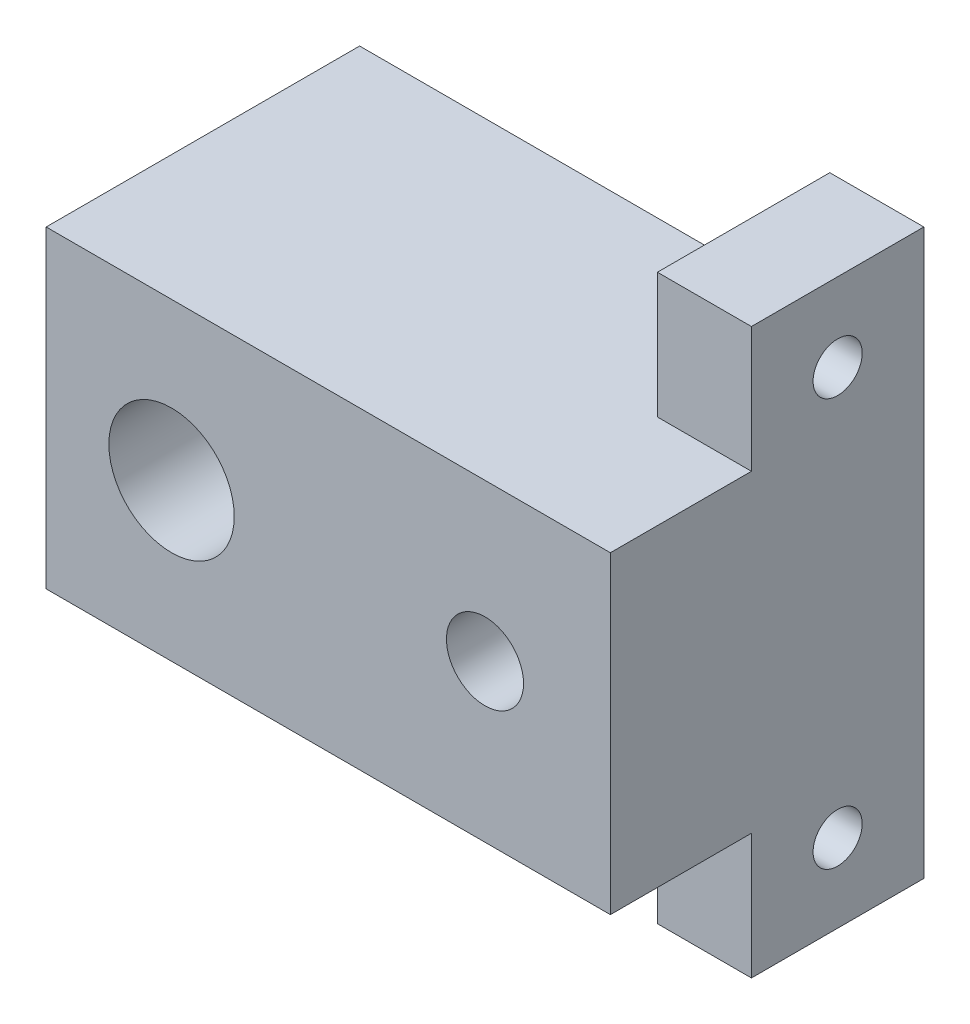
ISO-10303-21;
HEADER;
FILE_DESCRIPTION(('STEP AP214'),'2;1');
FILE_NAME('part.step','',(''),(''),'','','');
FILE_SCHEMA(('AUTOMOTIVE_DESIGN { 1 0 10303 214 1 1 1 1 }'));
ENDSEC;
DATA;
#1=APPLICATION_CONTEXT('core data for automotive mechanical design processes');
#2=APPLICATION_PROTOCOL_DEFINITION('international standard','automotive_design',2000,#1);
#3=PRODUCT_CONTEXT('',#1,'mechanical');
#4=PRODUCT('Part','Part','',(#3));
#5=PRODUCT_RELATED_PRODUCT_CATEGORY('part','',(#4));
#6=PRODUCT_DEFINITION_FORMATION('','',#4);
#7=PRODUCT_DEFINITION_CONTEXT('part definition',#1,'design');
#8=PRODUCT_DEFINITION('design','',#6,#7);
#9=PRODUCT_DEFINITION_SHAPE('','',#8);
#10=(LENGTH_UNIT() NAMED_UNIT(*) SI_UNIT(.MILLI.,.METRE.));
#11=(NAMED_UNIT(*) PLANE_ANGLE_UNIT() SI_UNIT($,.RADIAN.));
#12=(NAMED_UNIT(*) SI_UNIT($,.STERADIAN.) SOLID_ANGLE_UNIT());
#13=UNCERTAINTY_MEASURE_WITH_UNIT(LENGTH_MEASURE(1.E-05),#10,'distance_accuracy_value','');
#14=(GEOMETRIC_REPRESENTATION_CONTEXT(3) GLOBAL_UNCERTAINTY_ASSIGNED_CONTEXT((#13)) GLOBAL_UNIT_ASSIGNED_CONTEXT((#10,
#11,#12)) REPRESENTATION_CONTEXT('',''));
#15=CARTESIAN_POINT('',(0.,0.,0.));
#16=DIRECTION('',(0.,0.,1.));
#17=DIRECTION('',(1.,0.,0.));
#18=AXIS2_PLACEMENT_3D('',#15,#16,#17);
#19=CARTESIAN_POINT('',(0.,5.00000000000001,0.));
#20=DIRECTION('',(0.,-1.,0.));
#21=DIRECTION('',(0.,0.,-1.));
#22=AXIS2_PLACEMENT_3D('',#19,#20,#21);
#23=PLANE('',#22);
#24=DIRECTION('',(1.,0.,0.));
#25=VECTOR('',#24,1.);
#26=CARTESIAN_POINT('',(7.5,5.00000000000001,5.5));
#27=LINE('',#26,#25);
#28=CARTESIAN_POINT('',(4.5,5.00000000000001,5.5));
#29=VERTEX_POINT('',#28);
#30=CARTESIAN_POINT('',(7.5,5.00000000000001,5.5));
#31=VERTEX_POINT('',#30);
#32=EDGE_CURVE('E161',#29,#31,#27,.T.);
#33=ORIENTED_EDGE('',*,*,#32,.F.);
#34=DIRECTION('',(0.,0.,1.));
#35=VECTOR('',#34,1.);
#36=CARTESIAN_POINT('',(4.5,5.00000000000001,5.5));
#37=LINE('',#36,#35);
#38=CARTESIAN_POINT('',(4.5,5.00000000000001,0.));
#39=VERTEX_POINT('',#38);
#40=EDGE_CURVE('E164',#39,#29,#37,.T.);
#41=ORIENTED_EDGE('',*,*,#40,.F.);
#42=DIRECTION('',(1.,0.,0.));
#43=VECTOR('',#42,1.);
#44=CARTESIAN_POINT('',(-10.5,5.00000000000001,0.));
#45=LINE('',#44,#43);
#46=CARTESIAN_POINT('',(-10.5,5.00000000000001,0.));
#47=VERTEX_POINT('',#46);
#48=EDGE_CURVE('E189',#47,#39,#45,.T.);
#49=ORIENTED_EDGE('',*,*,#48,.F.);
#50=DIRECTION('',(0.,0.,-1.));
#51=VECTOR('',#50,1.);
#52=CARTESIAN_POINT('',(-10.5,5.00000000000001,10.));
#53=LINE('',#52,#51);
#54=CARTESIAN_POINT('',(-10.5,5.00000000000001,10.));
#55=VERTEX_POINT('',#54);
#56=EDGE_CURVE('E180',#55,#47,#53,.T.);
#57=ORIENTED_EDGE('',*,*,#56,.F.);
#58=DIRECTION('',(-1.,0.,0.));
#59=VECTOR('',#58,1.);
#60=CARTESIAN_POINT('',(7.5,5.00000000000001,10.));
#61=LINE('',#60,#59);
#62=CARTESIAN_POINT('',(7.5,5.00000000000001,10.));
#63=VERTEX_POINT('',#62);
#64=EDGE_CURVE('E185',#63,#55,#61,.T.);
#65=ORIENTED_EDGE('',*,*,#64,.F.);
#66=DIRECTION('',(0.,0.,1.));
#67=VECTOR('',#66,1.);
#68=CARTESIAN_POINT('',(7.5,5.00000000000001,0.));
#69=LINE('',#68,#67);
#70=EDGE_CURVE('E186',#31,#63,#69,.T.);
#71=ORIENTED_EDGE('',*,*,#70,.F.);
#72=EDGE_LOOP('',(#33,#41,#49,#57,#65,#71));
#73=FACE_BOUND('',#72,.T.);
#74=ADVANCED_FACE('F38',(#73),#23,.F.);
#75=CARTESIAN_POINT('',(-10.5,5.00000000000001,10.));
#76=DIRECTION('',(-1.,0.,0.));
#77=DIRECTION('',(0.,0.,1.));
#78=AXIS2_PLACEMENT_3D('',#75,#76,#77);
#79=PLANE('',#78);
#80=DIRECTION('',(0.,0.,-1.));
#81=VECTOR('',#80,1.);
#82=CARTESIAN_POINT('',(-10.5,-4.99999999999999,10.));
#83=LINE('',#82,#81);
#84=CARTESIAN_POINT('',(-10.5,-4.99999999999999,10.));
#85=VERTEX_POINT('',#84);
#86=CARTESIAN_POINT('',(-10.5,-4.99999999999999,0.));
#87=VERTEX_POINT('',#86);
#88=EDGE_CURVE('E197',#85,#87,#83,.T.);
#89=ORIENTED_EDGE('',*,*,#88,.F.);
#90=DIRECTION('',(0.,-1.,0.));
#91=VECTOR('',#90,1.);
#92=CARTESIAN_POINT('',(-10.5,5.00000000000001,10.));
#93=LINE('',#92,#91);
#94=EDGE_CURVE('E11',#55,#85,#93,.T.);
#95=ORIENTED_EDGE('',*,*,#94,.F.);
#96=ORIENTED_EDGE('',*,*,#56,.T.);
#97=DIRECTION('',(0.,-1.,0.));
#98=VECTOR('',#97,1.);
#99=CARTESIAN_POINT('',(-10.5,5.00000000000001,0.));
#100=LINE('',#99,#98);
#101=EDGE_CURVE('E126',#47,#87,#100,.T.);
#102=ORIENTED_EDGE('',*,*,#101,.T.);
#103=EDGE_LOOP('',(#89,#95,#96,#102));
#104=FACE_BOUND('',#103,.T.);
#105=ADVANCED_FACE('F40',(#104),#79,.T.);
#106=CARTESIAN_POINT('',(7.5,5.00000000000001,10.));
#107=DIRECTION('',(0.,0.,1.));
#108=DIRECTION('',(1.,0.,0.));
#109=AXIS2_PLACEMENT_3D('',#106,#107,#108);
#110=PLANE('',#109);
#111=CARTESIAN_POINT('',(-6.5,0.,10.));
#112=DIRECTION('',(0.,0.,1.));
#113=DIRECTION('',(1.,0.,0.));
#114=AXIS2_PLACEMENT_3D('',#111,#112,#113);
#115=CIRCLE('',#114,1.99999999999999);
#116=CARTESIAN_POINT('',(-4.50000000000001,0.,10.));
#117=VERTEX_POINT('',#116);
#118=EDGE_CURVE('E295',#117,#117,#115,.T.);
#119=ORIENTED_EDGE('',*,*,#118,.F.);
#120=EDGE_LOOP('',(#119));
#121=FACE_BOUND('',#120,.T.);
#122=CARTESIAN_POINT('',(3.5,0.,10.));
#123=DIRECTION('',(0.,0.,1.));
#124=DIRECTION('',(1.,0.,0.));
#125=AXIS2_PLACEMENT_3D('',#122,#123,#124);
#126=CIRCLE('',#125,1.2295);
#127=CARTESIAN_POINT('',(4.7295,0.,10.));
#128=VERTEX_POINT('',#127);
#129=EDGE_CURVE('E300',#128,#128,#126,.T.);
#130=ORIENTED_EDGE('',*,*,#129,.F.);
#131=EDGE_LOOP('',(#130));
#132=FACE_BOUND('',#131,.T.);
#133=DIRECTION('',(-1.,0.,0.));
#134=VECTOR('',#133,1.);
#135=CARTESIAN_POINT('',(7.5,-4.99999999999999,10.));
#136=LINE('',#135,#134);
#137=CARTESIAN_POINT('',(7.5,-4.99999999999999,10.));
#138=VERTEX_POINT('',#137);
#139=EDGE_CURVE('E173',#138,#85,#136,.T.);
#140=ORIENTED_EDGE('',*,*,#139,.F.);
#141=DIRECTION('',(0.,-1.,0.));
#142=VECTOR('',#141,1.);
#143=CARTESIAN_POINT('',(7.5,5.00000000000001,10.));
#144=LINE('',#143,#142);
#145=EDGE_CURVE('E47',#63,#138,#144,.T.);
#146=ORIENTED_EDGE('',*,*,#145,.F.);
#147=ORIENTED_EDGE('',*,*,#64,.T.);
#148=ORIENTED_EDGE('',*,*,#94,.T.);
#149=EDGE_LOOP('',(#140,#146,#147,#148));
#150=FACE_BOUND('',#149,.T.);
#151=ADVANCED_FACE('F244',(#121,#132,#150),#110,.T.);
#152=CARTESIAN_POINT('',(7.5,5.00000000000001,0.));
#153=DIRECTION('',(1.,0.,0.));
#154=DIRECTION('',(0.,0.,-1.));
#155=AXIS2_PLACEMENT_3D('',#152,#153,#154);
#156=PLANE('',#155);
#157=CARTESIAN_POINT('',(7.5,-6.49999999999999,2.75));
#158=DIRECTION('',(1.,0.,0.));
#159=DIRECTION('',(0.,0.,-1.));
#160=AXIS2_PLACEMENT_3D('',#157,#158,#159);
#161=CIRCLE('',#160,0.7835);
#162=CARTESIAN_POINT('',(7.5,-6.49999999999999,1.9665));
#163=VERTEX_POINT('',#162);
#164=EDGE_CURVE('E308',#163,#163,#161,.T.);
#165=ORIENTED_EDGE('',*,*,#164,.F.);
#166=EDGE_LOOP('',(#165));
#167=FACE_BOUND('',#166,.T.);
#168=CARTESIAN_POINT('',(7.5,6.5,2.75));
#169=DIRECTION('',(1.,0.,0.));
#170=DIRECTION('',(0.,1.,0.));
#171=AXIS2_PLACEMENT_3D('',#168,#169,#170);
#172=CIRCLE('',#171,0.783500000000001);
#173=CARTESIAN_POINT('',(7.5,7.28350000000001,2.75));
#174=VERTEX_POINT('',#173);
#175=EDGE_CURVE('E313',#174,#174,#172,.T.);
#176=ORIENTED_EDGE('',*,*,#175,.F.);
#177=EDGE_LOOP('',(#176));
#178=FACE_BOUND('',#177,.T.);
#179=DIRECTION('',(0.,0.,1.));
#180=VECTOR('',#179,1.);
#181=CARTESIAN_POINT('',(7.5,-4.99999999999999,0.));
#182=LINE('',#181,#180);
#183=CARTESIAN_POINT('',(7.5,-4.99999999999999,5.5));
#184=VERTEX_POINT('',#183);
#185=EDGE_CURVE('E170',#184,#138,#182,.T.);
#186=ORIENTED_EDGE('',*,*,#185,.F.);
#187=DIRECTION('',(0.,1.,0.));
#188=VECTOR('',#187,1.);
#189=CARTESIAN_POINT('',(7.5,-8.99999999999999,5.5));
#190=LINE('',#189,#188);
#191=CARTESIAN_POINT('',(7.5,-8.99999999999999,5.5));
#192=VERTEX_POINT('',#191);
#193=EDGE_CURVE('E132',#192,#184,#190,.T.);
#194=ORIENTED_EDGE('',*,*,#193,.F.);
#195=DIRECTION('',(0.,0.,1.));
#196=VECTOR('',#195,1.);
#197=CARTESIAN_POINT('',(7.5,-8.99999999999999,5.5));
#198=LINE('',#197,#196);
#199=CARTESIAN_POINT('',(7.5,-8.99999999999999,0.));
#200=VERTEX_POINT('',#199);
#201=EDGE_CURVE('E129',#200,#192,#198,.T.);
#202=ORIENTED_EDGE('',*,*,#201,.F.);
#203=DIRECTION('',(0.,-1.,0.));
#204=VECTOR('',#203,1.);
#205=CARTESIAN_POINT('',(7.5,5.00000000000001,0.));
#206=LINE('',#205,#204);
#207=CARTESIAN_POINT('',(7.5,9.00000000000001,0.));
#208=VERTEX_POINT('',#207);
#209=EDGE_CURVE('E116',#208,#200,#206,.T.);
#210=ORIENTED_EDGE('',*,*,#209,.F.);
#211=DIRECTION('',(0.,0.,-1.));
#212=VECTOR('',#211,1.);
#213=CARTESIAN_POINT('',(7.5,9.00000000000001,0.));
#214=LINE('',#213,#212);
#215=CARTESIAN_POINT('',(7.5,9.00000000000001,5.5));
#216=VERTEX_POINT('',#215);
#217=EDGE_CURVE('E232',#216,#208,#214,.T.);
#218=ORIENTED_EDGE('',*,*,#217,.F.);
#219=DIRECTION('',(0.,-1.,0.));
#220=VECTOR('',#219,1.);
#221=CARTESIAN_POINT('',(7.5,9.00000000000001,5.5));
#222=LINE('',#221,#220);
#223=EDGE_CURVE('E198',#216,#31,#222,.T.);
#224=ORIENTED_EDGE('',*,*,#223,.T.);
#225=ORIENTED_EDGE('',*,*,#70,.T.);
#226=ORIENTED_EDGE('',*,*,#145,.T.);
#227=EDGE_LOOP('',(#186,#194,#202,#210,#218,#224,#225,#226));
#228=FACE_BOUND('',#227,.T.);
#229=ADVANCED_FACE('F130',(#167,#178,#228),#156,.T.);
#230=CARTESIAN_POINT('',(-10.5,5.00000000000001,0.));
#231=DIRECTION('',(0.,0.,-1.));
#232=DIRECTION('',(-1.,0.,0.));
#233=AXIS2_PLACEMENT_3D('',#230,#231,#232);
#234=PLANE('',#233);
#235=CARTESIAN_POINT('',(-6.5,0.,0.));
#236=DIRECTION('',(0.,0.,-1.));
#237=DIRECTION('',(-1.,0.,0.));
#238=AXIS2_PLACEMENT_3D('',#235,#236,#237);
#239=CIRCLE('',#238,1.99999999999999);
#240=CARTESIAN_POINT('',(-8.49999999999998,0.,0.));
#241=VERTEX_POINT('',#240);
#242=EDGE_CURVE('E298',#241,#241,#239,.T.);
#243=ORIENTED_EDGE('',*,*,#242,.F.);
#244=EDGE_LOOP('',(#243));
#245=FACE_BOUND('',#244,.T.);
#246=CARTESIAN_POINT('',(3.5,0.,0.));
#247=DIRECTION('',(0.,0.,1.));
#248=DIRECTION('',(1.,0.,0.));
#249=AXIS2_PLACEMENT_3D('',#246,#247,#248);
#250=CIRCLE('',#249,1.2295);
#251=CARTESIAN_POINT('',(4.7295,0.,0.));
#252=VERTEX_POINT('',#251);
#253=EDGE_CURVE('E305',#252,#252,#250,.T.);
#254=ORIENTED_EDGE('',*,*,#253,.T.);
#255=EDGE_LOOP('',(#254));
#256=FACE_BOUND('',#255,.T.);
#257=DIRECTION('',(1.,0.,0.));
#258=VECTOR('',#257,1.);
#259=CARTESIAN_POINT('',(-10.5,-4.99999999999999,0.));
#260=LINE('',#259,#258);
#261=CARTESIAN_POINT('',(4.5,-4.99999999999999,0.));
#262=VERTEX_POINT('',#261);
#263=EDGE_CURVE('E61',#87,#262,#260,.T.);
#264=ORIENTED_EDGE('',*,*,#263,.F.);
#265=ORIENTED_EDGE('',*,*,#101,.F.);
#266=ORIENTED_EDGE('',*,*,#48,.T.);
#267=DIRECTION('',(0.,-1.,0.));
#268=VECTOR('',#267,1.);
#269=CARTESIAN_POINT('',(4.5,9.00000000000001,0.));
#270=LINE('',#269,#268);
#271=CARTESIAN_POINT('',(4.5,9.00000000000001,0.));
#272=VERTEX_POINT('',#271);
#273=EDGE_CURVE('E201',#272,#39,#270,.T.);
#274=ORIENTED_EDGE('',*,*,#273,.F.);
#275=DIRECTION('',(-1.,0.,0.));
#276=VECTOR('',#275,1.);
#277=CARTESIAN_POINT('',(4.5,9.00000000000001,0.));
#278=LINE('',#277,#276);
#279=EDGE_CURVE('E123',#208,#272,#278,.T.);
#280=ORIENTED_EDGE('',*,*,#279,.F.);
#281=ORIENTED_EDGE('',*,*,#209,.T.);
#282=DIRECTION('',(1.,0.,0.));
#283=VECTOR('',#282,1.);
#284=CARTESIAN_POINT('',(7.5,-8.99999999999999,0.));
#285=LINE('',#284,#283);
#286=CARTESIAN_POINT('',(4.5,-8.99999999999999,0.));
#287=VERTEX_POINT('',#286);
#288=EDGE_CURVE('E121',#287,#200,#285,.T.);
#289=ORIENTED_EDGE('',*,*,#288,.F.);
#290=DIRECTION('',(0.,1.,0.));
#291=VECTOR('',#290,1.);
#292=CARTESIAN_POINT('',(4.5,-8.99999999999999,0.));
#293=LINE('',#292,#291);
#294=EDGE_CURVE('E150',#287,#262,#293,.T.);
#295=ORIENTED_EDGE('',*,*,#294,.T.);
#296=EDGE_LOOP('',(#264,#265,#266,#274,#280,#281,#289,#295));
#297=FACE_BOUND('',#296,.T.);
#298=ADVANCED_FACE('F118',(#245,#256,#297),#234,.T.);
#299=CARTESIAN_POINT('',(0.,-4.99999999999999,0.));
#300=DIRECTION('',(0.,-1.,0.));
#301=DIRECTION('',(0.,0.,-1.));
#302=AXIS2_PLACEMENT_3D('',#299,#300,#301);
#303=PLANE('',#302);
#304=DIRECTION('',(0.,0.,-1.));
#305=VECTOR('',#304,1.);
#306=CARTESIAN_POINT('',(4.5,-4.99999999999999,0.));
#307=LINE('',#306,#305);
#308=CARTESIAN_POINT('',(4.5,-4.99999999999999,5.5));
#309=VERTEX_POINT('',#308);
#310=EDGE_CURVE('E141',#309,#262,#307,.T.);
#311=ORIENTED_EDGE('',*,*,#310,.F.);
#312=DIRECTION('',(-1.,0.,0.));
#313=VECTOR('',#312,1.);
#314=CARTESIAN_POINT('',(4.5,-4.99999999999999,5.5));
#315=LINE('',#314,#313);
#316=EDGE_CURVE('E55',#184,#309,#315,.T.);
#317=ORIENTED_EDGE('',*,*,#316,.F.);
#318=ORIENTED_EDGE('',*,*,#185,.T.);
#319=ORIENTED_EDGE('',*,*,#139,.T.);
#320=ORIENTED_EDGE('',*,*,#88,.T.);
#321=ORIENTED_EDGE('',*,*,#263,.T.);
#322=EDGE_LOOP('',(#311,#317,#318,#319,#320,#321));
#323=FACE_BOUND('',#322,.T.);
#324=ADVANCED_FACE('F245',(#323),#303,.T.);
#325=CARTESIAN_POINT('',(7.5,9.00000000000001,5.5));
#326=DIRECTION('',(0.,0.,-1.));
#327=DIRECTION('',(-1.,0.,0.));
#328=AXIS2_PLACEMENT_3D('',#325,#326,#327);
#329=PLANE('',#328);
#330=ORIENTED_EDGE('',*,*,#32,.T.);
#331=ORIENTED_EDGE('',*,*,#223,.F.);
#332=DIRECTION('',(1.,0.,0.));
#333=VECTOR('',#332,1.);
#334=CARTESIAN_POINT('',(7.5,9.00000000000001,5.5));
#335=LINE('',#334,#333);
#336=CARTESIAN_POINT('',(4.5,9.00000000000001,5.5));
#337=VERTEX_POINT('',#336);
#338=EDGE_CURVE('E233',#337,#216,#335,.T.);
#339=ORIENTED_EDGE('',*,*,#338,.F.);
#340=DIRECTION('',(0.,-1.,0.));
#341=VECTOR('',#340,1.);
#342=CARTESIAN_POINT('',(4.5,9.00000000000001,5.5));
#343=LINE('',#342,#341);
#344=EDGE_CURVE('E205',#337,#29,#343,.T.);
#345=ORIENTED_EDGE('',*,*,#344,.T.);
#346=EDGE_LOOP('',(#330,#331,#339,#345));
#347=FACE_BOUND('',#346,.T.);
#348=ADVANCED_FACE('F239',(#347),#329,.F.);
#349=CARTESIAN_POINT('',(4.5,9.00000000000001,5.5));
#350=DIRECTION('',(1.,0.,0.));
#351=DIRECTION('',(0.,0.,-1.));
#352=AXIS2_PLACEMENT_3D('',#349,#350,#351);
#353=PLANE('',#352);
#354=CARTESIAN_POINT('',(4.5,6.50000000000001,2.75));
#355=DIRECTION('',(1.,0.,0.));
#356=DIRECTION('',(0.,1.,0.));
#357=AXIS2_PLACEMENT_3D('',#354,#355,#356);
#358=CIRCLE('',#357,0.7835);
#359=CARTESIAN_POINT('',(4.5,7.28350000000001,2.75));
#360=VERTEX_POINT('',#359);
#361=EDGE_CURVE('E145',#360,#360,#358,.T.);
#362=ORIENTED_EDGE('',*,*,#361,.T.);
#363=EDGE_LOOP('',(#362));
#364=FACE_BOUND('',#363,.T.);
#365=ORIENTED_EDGE('',*,*,#40,.T.);
#366=ORIENTED_EDGE('',*,*,#344,.F.);
#367=DIRECTION('',(0.,0.,1.));
#368=VECTOR('',#367,1.);
#369=CARTESIAN_POINT('',(4.5,9.00000000000001,5.5));
#370=LINE('',#369,#368);
#371=EDGE_CURVE('E215',#272,#337,#370,.T.);
#372=ORIENTED_EDGE('',*,*,#371,.F.);
#373=ORIENTED_EDGE('',*,*,#273,.T.);
#374=EDGE_LOOP('',(#365,#366,#372,#373));
#375=FACE_BOUND('',#374,.T.);
#376=ADVANCED_FACE('F227',(#364,#375),#353,.F.);
#377=CARTESIAN_POINT('',(0.,9.00000000000001,0.));
#378=DIRECTION('',(0.,-1.,0.));
#379=DIRECTION('',(0.,0.,-1.));
#380=AXIS2_PLACEMENT_3D('',#377,#378,#379);
#381=PLANE('',#380);
#382=ORIENTED_EDGE('',*,*,#338,.T.);
#383=ORIENTED_EDGE('',*,*,#217,.T.);
#384=ORIENTED_EDGE('',*,*,#279,.T.);
#385=ORIENTED_EDGE('',*,*,#371,.T.);
#386=EDGE_LOOP('',(#382,#383,#384,#385));
#387=FACE_BOUND('',#386,.T.);
#388=ADVANCED_FACE('F237',(#387),#381,.F.);
#389=CARTESIAN_POINT('',(4.5,-8.99999999999999,5.5));
#390=DIRECTION('',(0.,0.,-1.));
#391=DIRECTION('',(-1.,0.,0.));
#392=AXIS2_PLACEMENT_3D('',#389,#390,#391);
#393=PLANE('',#392);
#394=ORIENTED_EDGE('',*,*,#316,.T.);
#395=DIRECTION('',(0.,1.,0.));
#396=VECTOR('',#395,1.);
#397=CARTESIAN_POINT('',(4.5,-8.99999999999999,5.5));
#398=LINE('',#397,#396);
#399=CARTESIAN_POINT('',(4.5,-8.99999999999999,5.5));
#400=VERTEX_POINT('',#399);
#401=EDGE_CURVE('E153',#400,#309,#398,.T.);
#402=ORIENTED_EDGE('',*,*,#401,.F.);
#403=DIRECTION('',(-1.,0.,0.));
#404=VECTOR('',#403,1.);
#405=CARTESIAN_POINT('',(4.5,-8.99999999999999,5.5));
#406=LINE('',#405,#404);
#407=EDGE_CURVE('E135',#192,#400,#406,.T.);
#408=ORIENTED_EDGE('',*,*,#407,.F.);
#409=ORIENTED_EDGE('',*,*,#193,.T.);
#410=EDGE_LOOP('',(#394,#402,#408,#409));
#411=FACE_BOUND('',#410,.T.);
#412=ADVANCED_FACE('F266',(#411),#393,.F.);
#413=CARTESIAN_POINT('',(4.5,-8.99999999999999,0.));
#414=DIRECTION('',(1.,0.,0.));
#415=DIRECTION('',(0.,0.,-1.));
#416=AXIS2_PLACEMENT_3D('',#413,#414,#415);
#417=PLANE('',#416);
#418=CARTESIAN_POINT('',(4.5,-6.49999999999999,2.75));
#419=DIRECTION('',(1.,0.,0.));
#420=DIRECTION('',(0.,0.,-1.));
#421=AXIS2_PLACEMENT_3D('',#418,#419,#420);
#422=CIRCLE('',#421,0.7835);
#423=CARTESIAN_POINT('',(4.5,-6.49999999999999,1.9665));
#424=VERTEX_POINT('',#423);
#425=EDGE_CURVE('E311',#424,#424,#422,.T.);
#426=ORIENTED_EDGE('',*,*,#425,.T.);
#427=EDGE_LOOP('',(#426));
#428=FACE_BOUND('',#427,.T.);
#429=ORIENTED_EDGE('',*,*,#310,.T.);
#430=ORIENTED_EDGE('',*,*,#294,.F.);
#431=DIRECTION('',(0.,0.,-1.));
#432=VECTOR('',#431,1.);
#433=CARTESIAN_POINT('',(4.5,-8.99999999999999,0.));
#434=LINE('',#433,#432);
#435=EDGE_CURVE('E139',#400,#287,#434,.T.);
#436=ORIENTED_EDGE('',*,*,#435,.F.);
#437=ORIENTED_EDGE('',*,*,#401,.T.);
#438=EDGE_LOOP('',(#429,#430,#436,#437));
#439=FACE_BOUND('',#438,.T.);
#440=ADVANCED_FACE('F269',(#428,#439),#417,.F.);
#441=CARTESIAN_POINT('',(0.,-8.99999999999999,0.));
#442=DIRECTION('',(0.,1.,0.));
#443=DIRECTION('',(0.,0.,1.));
#444=AXIS2_PLACEMENT_3D('',#441,#442,#443);
#445=PLANE('',#444);
#446=ORIENTED_EDGE('',*,*,#288,.T.);
#447=ORIENTED_EDGE('',*,*,#201,.T.);
#448=ORIENTED_EDGE('',*,*,#407,.T.);
#449=ORIENTED_EDGE('',*,*,#435,.T.);
#450=EDGE_LOOP('',(#446,#447,#448,#449));
#451=FACE_BOUND('',#450,.T.);
#452=ADVANCED_FACE('F137',(#451),#445,.F.);
#453=CARTESIAN_POINT('',(4.5,6.50000000000001,2.75));
#454=DIRECTION('',(1.,0.,0.));
#455=DIRECTION('',(0.,1.,0.));
#456=AXIS2_PLACEMENT_3D('',#453,#454,#455);
#457=CYLINDRICAL_SURFACE('',#456,0.783500000000001);
#458=ORIENTED_EDGE('',*,*,#361,.F.);
#459=EDGE_LOOP('',(#458));
#460=FACE_BOUND('',#459,.T.);
#461=ORIENTED_EDGE('',*,*,#175,.T.);
#462=EDGE_LOOP('',(#461));
#463=FACE_BOUND('',#462,.T.);
#464=ADVANCED_FACE('F275',(#460,#463),#457,.F.);
#465=CARTESIAN_POINT('',(4.5,-6.49999999999999,2.75));
#466=DIRECTION('',(1.,0.,0.));
#467=DIRECTION('',(0.,0.,-1.));
#468=AXIS2_PLACEMENT_3D('',#465,#466,#467);
#469=CYLINDRICAL_SURFACE('',#468,0.7835);
#470=ORIENTED_EDGE('',*,*,#425,.F.);
#471=EDGE_LOOP('',(#470));
#472=FACE_BOUND('',#471,.T.);
#473=ORIENTED_EDGE('',*,*,#164,.T.);
#474=EDGE_LOOP('',(#473));
#475=FACE_BOUND('',#474,.T.);
#476=ADVANCED_FACE('F278',(#472,#475),#469,.F.);
#477=CARTESIAN_POINT('',(3.5,0.,0.));
#478=DIRECTION('',(0.,0.,1.));
#479=DIRECTION('',(1.,0.,0.));
#480=AXIS2_PLACEMENT_3D('',#477,#478,#479);
#481=CYLINDRICAL_SURFACE('',#480,1.2295);
#482=ORIENTED_EDGE('',*,*,#253,.F.);
#483=EDGE_LOOP('',(#482));
#484=FACE_BOUND('',#483,.T.);
#485=ORIENTED_EDGE('',*,*,#129,.T.);
#486=EDGE_LOOP('',(#485));
#487=FACE_BOUND('',#486,.T.);
#488=ADVANCED_FACE('F282',(#484,#487),#481,.F.);
#489=CARTESIAN_POINT('',(-6.5,0.,0.));
#490=DIRECTION('',(0.,0.,-1.));
#491=DIRECTION('',(-1.,0.,0.));
#492=AXIS2_PLACEMENT_3D('',#489,#490,#491);
#493=CYLINDRICAL_SURFACE('',#492,1.99999999999999);
#494=ORIENTED_EDGE('',*,*,#118,.T.);
#495=EDGE_LOOP('',(#494));
#496=FACE_BOUND('',#495,.T.);
#497=ORIENTED_EDGE('',*,*,#242,.T.);
#498=EDGE_LOOP('',(#497));
#499=FACE_BOUND('',#498,.T.);
#500=ADVANCED_FACE('F286',(#496,#499),#493,.F.);
#501=CLOSED_SHELL('',(#74,#105,#151,#229,#298,#324,#348,#376,#388,#412,#440,#452,#464,#476,#488,#500));
#502=MANIFOLD_SOLID_BREP('B2',#501);
#503=ADVANCED_BREP_SHAPE_REPRESENTATION('',(#18,#502),#14);
#504=SHAPE_DEFINITION_REPRESENTATION(#9,#503);
ENDSEC;
END-ISO-10303-21;
